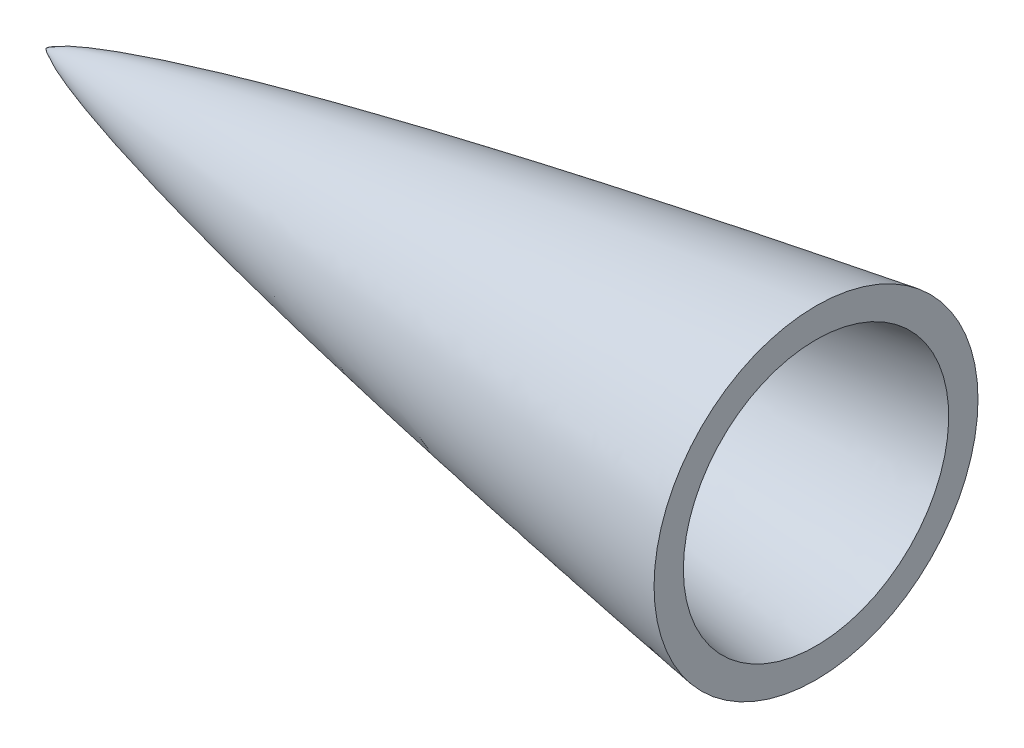
ISO-10303-21;
HEADER;
FILE_DESCRIPTION(('STEP AP214'),'2;1');
FILE_NAME('part.step','',(''),(''),'','','');
FILE_SCHEMA(('AUTOMOTIVE_DESIGN { 1 0 10303 214 1 1 1 1 }'));
ENDSEC;
DATA;
#1=APPLICATION_CONTEXT('core data for automotive mechanical design processes');
#2=APPLICATION_PROTOCOL_DEFINITION('international standard','automotive_design',2000,#1);
#3=PRODUCT_CONTEXT('',#1,'mechanical');
#4=PRODUCT('Part','Part','',(#3));
#5=PRODUCT_RELATED_PRODUCT_CATEGORY('part','',(#4));
#6=PRODUCT_DEFINITION_FORMATION('','',#4);
#7=PRODUCT_DEFINITION_CONTEXT('part definition',#1,'design');
#8=PRODUCT_DEFINITION('design','',#6,#7);
#9=PRODUCT_DEFINITION_SHAPE('','',#8);
#10=(LENGTH_UNIT() NAMED_UNIT(*) SI_UNIT(.MILLI.,.METRE.));
#11=(NAMED_UNIT(*) PLANE_ANGLE_UNIT() SI_UNIT($,.RADIAN.));
#12=(NAMED_UNIT(*) SI_UNIT($,.STERADIAN.) SOLID_ANGLE_UNIT());
#13=UNCERTAINTY_MEASURE_WITH_UNIT(LENGTH_MEASURE(1.E-05),#10,'distance_accuracy_value','');
#14=(GEOMETRIC_REPRESENTATION_CONTEXT(3) GLOBAL_UNCERTAINTY_ASSIGNED_CONTEXT((#13)) GLOBAL_UNIT_ASSIGNED_CONTEXT((#10,
#11,#12)) REPRESENTATION_CONTEXT('',''));
#15=CARTESIAN_POINT('',(0.,0.,0.));
#16=DIRECTION('',(0.,0.,1.));
#17=DIRECTION('',(1.,0.,0.));
#18=AXIS2_PLACEMENT_3D('',#15,#16,#17);
#19=CARTESIAN_POINT('',(596.9,52.74818,0.));
#20=CARTESIAN_POINT('',(594.981085772942,52.7439766182815,0.));
#21=CARTESIAN_POINT('',(591.143361642924,52.7119561177822,0.));
#22=CARTESIAN_POINT('',(583.468325071776,52.6115940478195,0.));
#23=CARTESIAN_POINT('',(571.206307330957,52.3702922496184,0.));
#24=CARTESIAN_POINT('',(556.277134536275,51.9856247831863,0.));
#25=CARTESIAN_POINT('',(534.095751609961,51.2822622218943,0.));
#26=CARTESIAN_POINT('',(506.5841207546,50.2205319325961,0.));
#27=CARTESIAN_POINT('',(474.496680759096,48.7563639094325,0.));
#28=CARTESIAN_POINT('',(437.838411885817,46.818732197122,0.));
#29=CARTESIAN_POINT('',(401.193599470544,44.6420572267023,0.));
#30=CARTESIAN_POINT('',(364.562894607915,42.2399567576188,0.));
#31=CARTESIAN_POINT('',(327.947239610889,39.618425854242,0.));
#32=CARTESIAN_POINT('',(291.348007401785,36.7768124514222,0.));
#33=CARTESIAN_POINT('',(254.767048184149,33.7085063186159,0.));
#34=CARTESIAN_POINT('',(218.207080059752,30.3992455850085,0.));
#35=CARTESIAN_POINT('',(181.67186265107,26.8260098654848,0.));
#36=CARTESIAN_POINT('',(145.167419267207,22.9502479118758,0.));
#37=CARTESIAN_POINT('',(108.703042074813,18.711081158448,0.));
#38=CARTESIAN_POINT('',(75.561592020845,14.4184193653755,0.));
#39=CARTESIAN_POINT('',(48.0380921073077,10.3790406790519,0.));
#40=CARTESIAN_POINT('',(27.782103231772,6.92717758336565,0.));
#41=CARTESIAN_POINT('',(15.6155281201881,4.51233854333897,0.));
#42=CARTESIAN_POINT('',(9.10026394578531,3.00434704709772,0.));
#43=CARTESIAN_POINT('',(6.09264242860423,2.21175303915275,0.));
#44=CARTESIAN_POINT('',(4.93563552969569,1.88238723916885,0.));
#45=CARTESIAN_POINT('',(4.77280588160991,1.8355007837493,0.));
#46=B_SPLINE_CURVE_WITH_KNOTS('',4,(#19,#20,#21,#22,#23,#24,#25,#26,#27,#28,#29,#30,#31,#32,#33,
#34,#35,#36,#37,#38,#39,#40,#41,#42,#43,#44,#45),.UNSPECIFIED.,.F.,.F.,(5,1,1,1,1,1,1,1,1,1,1,1,
1,1,1,1,1,1,1,1,1,1,1,5),(0.,0.0127915006460431,0.0255830012920861,0.0511660025841724,
0.0817539552175705,0.112341907850969,0.173517813554601,0.234693719179658,0.295869624144422,
0.357045529383124,0.418221434840136,0.479397340471153,0.54057324623338,0.601749151591606,
0.662925056674679,0.724100961894715,0.785276867533579,0.846452772012617,0.907628670550915,
0.946859777235718,0.970700652554181,0.983412262477229,0.990301731317356,0.991431253959526),.UNSPECIFIED.);
#47=CARTESIAN_POINT('',(0.,0.,0.));
#48=DIRECTION('',(-1.,0.,0.));
#49=AXIS1_PLACEMENT('',#47,#48);
#50=SURFACE_OF_REVOLUTION('',#46,#49);
#51=OFFSET_SURFACE('',#50,-1.91008,.F.);
#52=CARTESIAN_POINT('',(5.30133447994278,0.,0.));
#53=VERTEX_POINT('',#52);
#54=VERTEX_LOOP('',#53);
#55=FACE_BOUND('',#54,.T.);
#56=CARTESIAN_POINT('',(50.7999999999999,0.,0.));
#57=DIRECTION('',(-1.,0.,0.));
#58=DIRECTION('',(0.,0.,1.));
#59=AXIS2_PLACEMENT_3D('',#56,#57,#58);
#60=CIRCLE('',#59,8.75491993087911);
#61=CARTESIAN_POINT('',(50.7999999999999,0.,8.75491993087911));
#62=VERTEX_POINT('',#61);
#63=EDGE_CURVE('E39',#62,#62,#60,.F.);
#64=ORIENTED_EDGE('',*,*,#63,.T.);
#65=EDGE_LOOP('',(#64));
#66=FACE_BOUND('',#65,.T.);
#67=ADVANCED_FACE('F34',(#55,#66),#51,.F.);
#68=CARTESIAN_POINT('',(50.8,0.,0.));
#69=DIRECTION('',(1.,0.,0.));
#70=DIRECTION('',(0.,0.,-1.));
#71=AXIS2_PLACEMENT_3D('',#68,#69,#70);
#72=PLANE('',#71);
#73=ORIENTED_EDGE('',*,*,#63,.F.);
#74=EDGE_LOOP('',(#73));
#75=FACE_BOUND('',#74,.T.);
#76=CARTESIAN_POINT('',(50.8000000000001,0.,0.));
#77=DIRECTION('',(-1.,0.,0.));
#78=DIRECTION('',(0.,0.,1.));
#79=AXIS2_PLACEMENT_3D('',#76,#77,#78);
#80=CIRCLE('',#79,10.6878333302251);
#81=CARTESIAN_POINT('',(50.8000000000001,0.,10.6878333302251));
#82=VERTEX_POINT('',#81);
#83=EDGE_CURVE('E11',#82,#82,#80,.F.);
#84=ORIENTED_EDGE('',*,*,#83,.T.);
#85=EDGE_LOOP('',(#84));
#86=FACE_BOUND('',#85,.T.);
#87=ADVANCED_FACE('F51',(#75,#86),#72,.T.);
#88=CARTESIAN_POINT('',(596.9,52.74818,0.));
#89=CARTESIAN_POINT('',(594.981085772942,52.7439766182815,0.));
#90=CARTESIAN_POINT('',(591.143361642924,52.7119561177822,0.));
#91=CARTESIAN_POINT('',(583.468325071776,52.6115940478195,0.));
#92=CARTESIAN_POINT('',(571.206307330957,52.3702922496184,0.));
#93=CARTESIAN_POINT('',(556.277134536275,51.9856247831863,0.));
#94=CARTESIAN_POINT('',(534.095751609961,51.2822622218943,0.));
#95=CARTESIAN_POINT('',(506.5841207546,50.2205319325961,0.));
#96=CARTESIAN_POINT('',(474.496680759096,48.7563639094325,0.));
#97=CARTESIAN_POINT('',(437.838411885817,46.818732197122,0.));
#98=CARTESIAN_POINT('',(401.193599470544,44.6420572267023,0.));
#99=CARTESIAN_POINT('',(364.562894607915,42.2399567576188,0.));
#100=CARTESIAN_POINT('',(327.947239610889,39.618425854242,0.));
#101=CARTESIAN_POINT('',(291.348007401785,36.7768124514222,0.));
#102=CARTESIAN_POINT('',(254.767048184149,33.7085063186159,0.));
#103=CARTESIAN_POINT('',(218.207080059752,30.3992455850085,0.));
#104=CARTESIAN_POINT('',(181.67186265107,26.8260098654848,0.));
#105=CARTESIAN_POINT('',(145.167419267207,22.9502479118758,0.));
#106=CARTESIAN_POINT('',(108.703042074813,18.711081158448,0.));
#107=CARTESIAN_POINT('',(75.561592020845,14.4184193653755,0.));
#108=CARTESIAN_POINT('',(48.0380921073077,10.3790406790519,0.));
#109=CARTESIAN_POINT('',(27.782103231772,6.92717758336565,0.));
#110=CARTESIAN_POINT('',(15.6155281201881,4.51233854333897,0.));
#111=CARTESIAN_POINT('',(8.71933118048638,2.91617819387342,0.));
#112=CARTESIAN_POINT('',(5.02966537861984,1.92884340558088,0.));
#113=CARTESIAN_POINT('',(3.02858814726836,1.31676153051974,0.));
#114=CARTESIAN_POINT('',(1.91317692998907,0.93176035109636,0.));
#115=CARTESIAN_POINT('',(1.29300271208459,0.693253150144167,0.));
#116=CARTESIAN_POINT('',(0.932165851339865,0.541497874129996,0.));
#117=CARTESIAN_POINT('',(0.699728382330023,0.436250009913596,0.));
#118=CARTESIAN_POINT('',(0.539072772842008,0.359186242832004,0.));
#119=CARTESIAN_POINT('',(0.399119277455206,0.287038857933432,0.));
#120=CARTESIAN_POINT('',(0.279818282563663,0.220197585336474,0.));
#121=CARTESIAN_POINT('',(0.180428525159842,0.158737146182066,0.));
#122=CARTESIAN_POINT('',(0.110473241421188,0.110595859922417,0.));
#123=CARTESIAN_POINT('',(0.0582878402621543,0.0690247542532056,0.));
#124=CARTESIAN_POINT('',(0.023331290383149,0.0352525733814115,0.));
#125=CARTESIAN_POINT('',(0.00804574966633972,0.0163261743468633,0.));
#126=CARTESIAN_POINT('',(0.00237693213132801,0.00563433549737124,0.));
#127=CARTESIAN_POINT('',(0.,0.,0.));
#128=B_SPLINE_CURVE_WITH_KNOTS('',4,(#88,#89,#90,#91,#92,#93,#94,#95,#96,#97,#98,#99,#100,#101,
#102,#103,#104,#105,#106,#107,#108,#109,#110,#111,#112,#113,#114,#115,#116,#117,#118,#119,#120,
#121,#122,#123,#124,#125,#126,#127),.UNSPECIFIED.,.F.,.F.,(5,1,1,1,1,1,1,1,1,1,1,1,1,1,1,1,1,1,
1,1,1,1,1,1,1,1,1,1,1,1,1,1,1,1,1,1,5),(0.,0.0127915006460431,0.0255830012920861,
0.0511660025841724,0.0817539552175705,0.112341907850969,0.173517813554601,0.234693719179658,
0.295869624144422,0.357045529383124,0.418221434840136,0.479397340471153,0.54057324623338,
0.601749151591606,0.662925056674679,0.724100961894715,0.785276867533579,0.846452772012617,
0.907628670550915,0.946859777235718,0.970700652554181,0.983412262477229,0.990301731317356,
0.994037247427691,0.996156512029755,0.997358787258242,0.99816596334814,0.998465742833605,
0.99876552231907,0.99905955597412,0.99935358962917,0.999515192221878,0.999676794814585,
0.999838397407293,0.999919198703646,0.999959599351823,1.),.UNSPECIFIED.);
#129=CARTESIAN_POINT('',(0.,0.,0.));
#130=DIRECTION('',(-1.,0.,0.));
#131=AXIS1_PLACEMENT('',#129,#130);
#132=SURFACE_OF_REVOLUTION('',#128,#131);
#133=CARTESIAN_POINT('',(0.,0.,0.));
#134=VERTEX_POINT('',#133);
#135=VERTEX_LOOP('',#134);
#136=FACE_BOUND('',#135,.T.);
#137=ORIENTED_EDGE('',*,*,#83,.F.);
#138=EDGE_LOOP('',(#137));
#139=FACE_BOUND('',#138,.T.);
#140=ADVANCED_FACE('F36',(#136,#139),#132,.T.);
#141=CLOSED_SHELL('',(#67,#87,#140));
#142=MANIFOLD_SOLID_BREP('B2',#141);
#143=ADVANCED_BREP_SHAPE_REPRESENTATION('',(#18,#142),#14);
#144=SHAPE_DEFINITION_REPRESENTATION(#9,#143);
ENDSEC;
END-ISO-10303-21;
